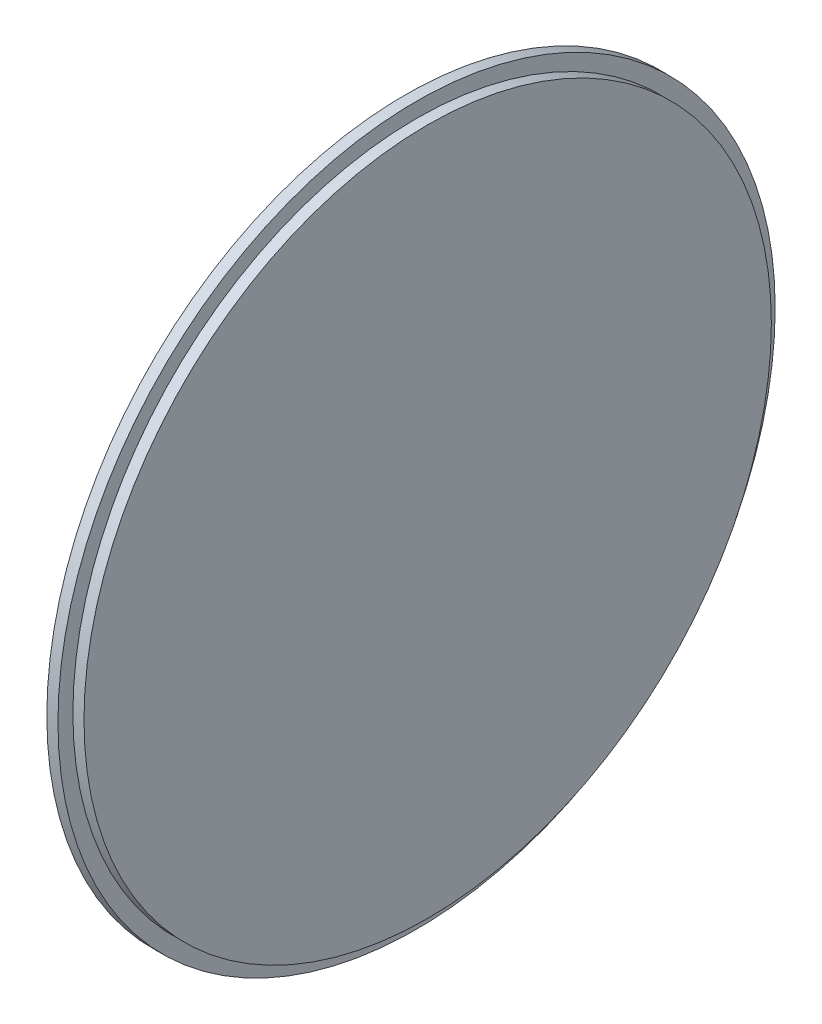
ISO-10303-21;
HEADER;
FILE_DESCRIPTION(('STEP AP214'),'2;1');
FILE_NAME('part.step','',(''),(''),'','','');
FILE_SCHEMA(('AUTOMOTIVE_DESIGN { 1 0 10303 214 1 1 1 1 }'));
ENDSEC;
DATA;
#1=APPLICATION_CONTEXT('core data for automotive mechanical design processes');
#2=APPLICATION_PROTOCOL_DEFINITION('international standard','automotive_design',2000,#1);
#3=PRODUCT_CONTEXT('',#1,'mechanical');
#4=PRODUCT('Part','Part','',(#3));
#5=PRODUCT_RELATED_PRODUCT_CATEGORY('part','',(#4));
#6=PRODUCT_DEFINITION_FORMATION('','',#4);
#7=PRODUCT_DEFINITION_CONTEXT('part definition',#1,'design');
#8=PRODUCT_DEFINITION('design','',#6,#7);
#9=PRODUCT_DEFINITION_SHAPE('','',#8);
#10=(LENGTH_UNIT() NAMED_UNIT(*) SI_UNIT(.MILLI.,.METRE.));
#11=(NAMED_UNIT(*) PLANE_ANGLE_UNIT() SI_UNIT($,.RADIAN.));
#12=(NAMED_UNIT(*) SI_UNIT($,.STERADIAN.) SOLID_ANGLE_UNIT());
#13=UNCERTAINTY_MEASURE_WITH_UNIT(LENGTH_MEASURE(1.E-05),#10,'distance_accuracy_value','');
#14=(GEOMETRIC_REPRESENTATION_CONTEXT(3) GLOBAL_UNCERTAINTY_ASSIGNED_CONTEXT((#13)) GLOBAL_UNIT_ASSIGNED_CONTEXT((#10,
#11,#12)) REPRESENTATION_CONTEXT('',''));
#15=CARTESIAN_POINT('',(0.,0.,0.));
#16=DIRECTION('',(0.,0.,1.));
#17=DIRECTION('',(1.,0.,0.));
#18=AXIS2_PLACEMENT_3D('',#15,#16,#17);
#19=CARTESIAN_POINT('',(1.1811,0.,0.));
#20=DIRECTION('',(-1.,0.,0.));
#21=DIRECTION('',(0.,0.,1.));
#22=AXIS2_PLACEMENT_3D('',#19,#20,#21);
#23=CYLINDRICAL_SURFACE('',#22,38.1);
#24=CARTESIAN_POINT('',(1.1811,0.,0.));
#25=DIRECTION('',(1.,0.,0.));
#26=DIRECTION('',(0.,0.,-1.));
#27=AXIS2_PLACEMENT_3D('',#24,#25,#26);
#28=CIRCLE('',#27,38.1);
#29=CARTESIAN_POINT('',(1.1811,0.,-38.1));
#30=VERTEX_POINT('',#29);
#31=EDGE_CURVE('E51',#30,#30,#28,.T.);
#32=ORIENTED_EDGE('',*,*,#31,.F.);
#33=EDGE_LOOP('',(#32));
#34=FACE_BOUND('',#33,.T.);
#35=CARTESIAN_POINT('',(0.,0.,0.));
#36=DIRECTION('',(1.,0.,0.));
#37=DIRECTION('',(0.,0.,-1.));
#38=AXIS2_PLACEMENT_3D('',#35,#36,#37);
#39=CIRCLE('',#38,38.1);
#40=CARTESIAN_POINT('',(0.,0.,-38.1));
#41=VERTEX_POINT('',#40);
#42=EDGE_CURVE('E46',#41,#41,#39,.T.);
#43=ORIENTED_EDGE('',*,*,#42,.T.);
#44=EDGE_LOOP('',(#43));
#45=FACE_BOUND('',#44,.T.);
#46=ADVANCED_FACE('F43',(#34,#45),#23,.T.);
#47=CARTESIAN_POINT('',(1.1811,0.,0.));
#48=DIRECTION('',(1.,0.,0.));
#49=DIRECTION('',(0.,0.,-1.));
#50=AXIS2_PLACEMENT_3D('',#47,#48,#49);
#51=PLANE('',#50);
#52=CARTESIAN_POINT('',(1.1811,0.,0.));
#53=DIRECTION('',(1.,0.,0.));
#54=DIRECTION('',(0.,0.,-1.));
#55=AXIS2_PLACEMENT_3D('',#52,#53,#54);
#56=CIRCLE('',#55,36.5125);
#57=CARTESIAN_POINT('',(1.1811,0.,-36.5125));
#58=VERTEX_POINT('',#57);
#59=EDGE_CURVE('E10',#58,#58,#56,.T.);
#60=ORIENTED_EDGE('',*,*,#59,.F.);
#61=EDGE_LOOP('',(#60));
#62=FACE_BOUND('',#61,.T.);
#63=ORIENTED_EDGE('',*,*,#31,.T.);
#64=EDGE_LOOP('',(#63));
#65=FACE_BOUND('',#64,.T.);
#66=ADVANCED_FACE('F71',(#62,#65),#51,.T.);
#67=CARTESIAN_POINT('',(0.,0.,0.));
#68=DIRECTION('',(1.,0.,0.));
#69=DIRECTION('',(0.,0.,-1.));
#70=AXIS2_PLACEMENT_3D('',#67,#68,#69);
#71=PLANE('',#70);
#72=ORIENTED_EDGE('',*,*,#42,.F.);
#73=EDGE_LOOP('',(#72));
#74=FACE_BOUND('',#73,.T.);
#75=ADVANCED_FACE('F68',(#74),#71,.F.);
#76=CARTESIAN_POINT('',(2.3622,0.,0.));
#77=DIRECTION('',(-1.,0.,0.));
#78=DIRECTION('',(0.,0.,1.));
#79=AXIS2_PLACEMENT_3D('',#76,#77,#78);
#80=CYLINDRICAL_SURFACE('',#79,36.5125);
#81=CARTESIAN_POINT('',(2.3622,0.,0.));
#82=DIRECTION('',(1.,0.,0.));
#83=DIRECTION('',(0.,0.,-1.));
#84=AXIS2_PLACEMENT_3D('',#81,#82,#83);
#85=CIRCLE('',#84,36.5125);
#86=CARTESIAN_POINT('',(2.3622,0.,-36.5125));
#87=VERTEX_POINT('',#86);
#88=EDGE_CURVE('E58',#87,#87,#85,.T.);
#89=ORIENTED_EDGE('',*,*,#88,.F.);
#90=EDGE_LOOP('',(#89));
#91=FACE_BOUND('',#90,.T.);
#92=ORIENTED_EDGE('',*,*,#59,.T.);
#93=EDGE_LOOP('',(#92));
#94=FACE_BOUND('',#93,.T.);
#95=ADVANCED_FACE('F70',(#91,#94),#80,.T.);
#96=CARTESIAN_POINT('',(2.3622,0.,0.));
#97=DIRECTION('',(1.,0.,0.));
#98=DIRECTION('',(0.,0.,-1.));
#99=AXIS2_PLACEMENT_3D('',#96,#97,#98);
#100=PLANE('',#99);
#101=ORIENTED_EDGE('',*,*,#88,.T.);
#102=EDGE_LOOP('',(#101));
#103=FACE_BOUND('',#102,.T.);
#104=ADVANCED_FACE('F77',(#103),#100,.T.);
#105=CLOSED_SHELL('',(#46,#66,#75,#95,#104));
#106=MANIFOLD_SOLID_BREP('B2',#105);
#107=ADVANCED_BREP_SHAPE_REPRESENTATION('',(#18,#106),#14);
#108=SHAPE_DEFINITION_REPRESENTATION(#9,#107);
ENDSEC;
END-ISO-10303-21;
